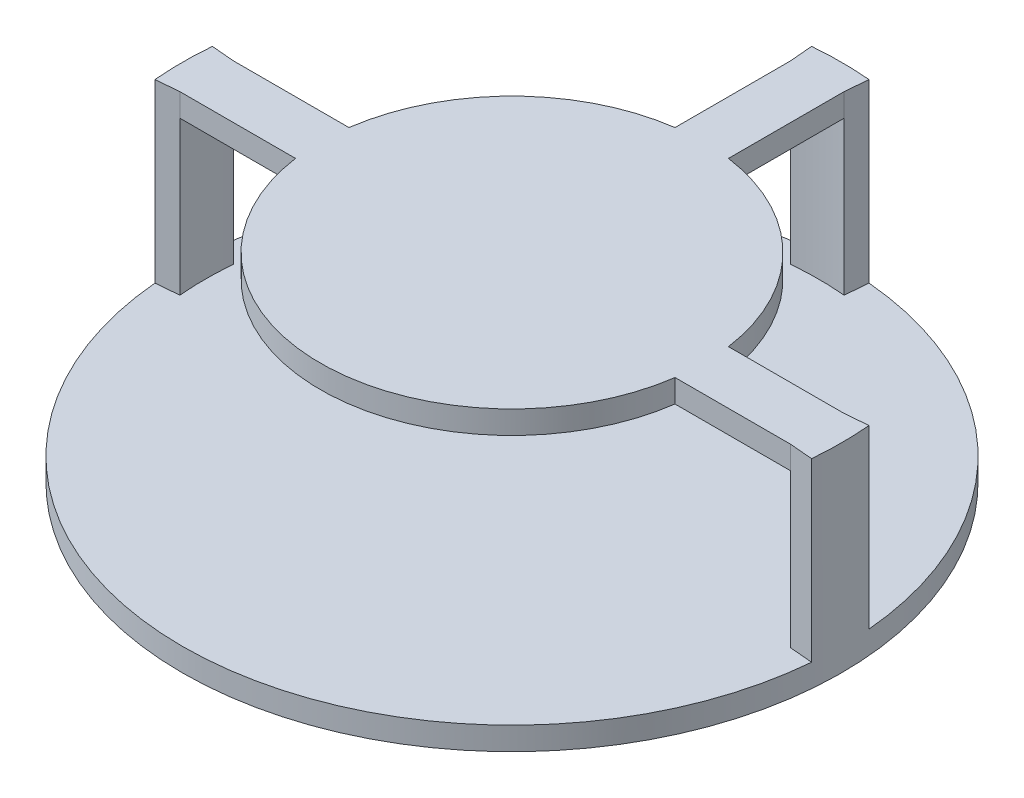
ISO-10303-21;
HEADER;
FILE_DESCRIPTION(('STEP AP214'),'2;1');
FILE_NAME('part.step','',(''),(''),'','','');
FILE_SCHEMA(('AUTOMOTIVE_DESIGN { 1 0 10303 214 1 1 1 1 }'));
ENDSEC;
DATA;
#1=APPLICATION_CONTEXT('core data for automotive mechanical design processes');
#2=APPLICATION_PROTOCOL_DEFINITION('international standard','automotive_design',2000,#1);
#3=PRODUCT_CONTEXT('',#1,'mechanical');
#4=PRODUCT('Part','Part','',(#3));
#5=PRODUCT_RELATED_PRODUCT_CATEGORY('part','',(#4));
#6=PRODUCT_DEFINITION_FORMATION('','',#4);
#7=PRODUCT_DEFINITION_CONTEXT('part definition',#1,'design');
#8=PRODUCT_DEFINITION('design','',#6,#7);
#9=PRODUCT_DEFINITION_SHAPE('','',#8);
#10=(LENGTH_UNIT() NAMED_UNIT(*) SI_UNIT(.MILLI.,.METRE.));
#11=(NAMED_UNIT(*) PLANE_ANGLE_UNIT() SI_UNIT($,.RADIAN.));
#12=(NAMED_UNIT(*) SI_UNIT($,.STERADIAN.) SOLID_ANGLE_UNIT());
#13=UNCERTAINTY_MEASURE_WITH_UNIT(LENGTH_MEASURE(1.E-05),#10,'distance_accuracy_value','');
#14=(GEOMETRIC_REPRESENTATION_CONTEXT(3) GLOBAL_UNCERTAINTY_ASSIGNED_CONTEXT((#13)) GLOBAL_UNIT_ASSIGNED_CONTEXT((#10,
#11,#12)) REPRESENTATION_CONTEXT('',''));
#15=CARTESIAN_POINT('',(0.,0.,0.));
#16=DIRECTION('',(0.,0.,1.));
#17=DIRECTION('',(1.,0.,0.));
#18=AXIS2_PLACEMENT_3D('',#15,#16,#17);
#19=CARTESIAN_POINT('',(0.,3.,0.));
#20=DIRECTION('',(0.,1.,0.));
#21=DIRECTION('',(0.,0.,1.));
#22=AXIS2_PLACEMENT_3D('',#19,#20,#21);
#23=PLANE('',#22);
#24=CARTESIAN_POINT('',(0.,3.,0.));
#25=DIRECTION('',(0.,1.,0.));
#26=DIRECTION('',(0.,0.,1.));
#27=AXIS2_PLACEMENT_3D('',#24,#25,#26);
#28=CIRCLE('',#27,43.);
#29=CARTESIAN_POINT('',(42.8363720179451,3.,-3.747696938149));
#30=VERTEX_POINT('',#29);
#31=CARTESIAN_POINT('',(3.74769693814913,3.,-42.8363720179451));
#32=VERTEX_POINT('',#31);
#33=EDGE_CURVE('E51',#30,#32,#28,.T.);
#34=ORIENTED_EDGE('',*,*,#33,.T.);
#35=DIRECTION('',(0.0871557427476543,0.,-0.996194698091746));
#36=VECTOR('',#35,1.);
#37=CARTESIAN_POINT('',(0.,3.,0.));
#38=LINE('',#37,#36);
#39=CARTESIAN_POINT('',(3.48622574690307,3.,-39.8477426263371));
#40=VERTEX_POINT('',#39);
#41=EDGE_CURVE('E59',#40,#32,#38,.T.);
#42=ORIENTED_EDGE('',*,*,#41,.F.);
#43=CARTESIAN_POINT('',(0.,3.,0.));
#44=DIRECTION('',(0.,1.,0.));
#45=DIRECTION('',(0.,0.,1.));
#46=AXIS2_PLACEMENT_3D('',#43,#44,#45);
#47=CIRCLE('',#46,39.9999545296388);
#48=CARTESIAN_POINT('',(-3.48622574690337,3.,-39.8477426263371));
#49=VERTEX_POINT('',#48);
#50=EDGE_CURVE('E64',#40,#49,#47,.T.);
#51=ORIENTED_EDGE('',*,*,#50,.T.);
#52=DIRECTION('',(-0.0871557427476619,0.,-0.996194698091745));
#53=VECTOR('',#52,1.);
#54=CARTESIAN_POINT('',(0.,3.,0.));
#55=LINE('',#54,#53);
#56=CARTESIAN_POINT('',(-3.74769693814946,3.,-42.836372017945));
#57=VERTEX_POINT('',#56);
#58=EDGE_CURVE('E348',#49,#57,#55,.T.);
#59=ORIENTED_EDGE('',*,*,#58,.T.);
#60=CARTESIAN_POINT('',(-42.8363720179451,3.,-3.747696938149));
#61=VERTEX_POINT('',#60);
#62=EDGE_CURVE('E52',#57,#61,#28,.T.);
#63=ORIENTED_EDGE('',*,*,#62,.T.);
#64=DIRECTION('',(-0.996194698091746,0.,-0.0871557427476513));
#65=VECTOR('',#64,1.);
#66=CARTESIAN_POINT('',(0.,3.,0.));
#67=LINE('',#66,#65);
#68=CARTESIAN_POINT('',(-39.8477426263371,3.,-3.48622574690295));
#69=VERTEX_POINT('',#68);
#70=EDGE_CURVE('E404',#69,#61,#67,.T.);
#71=ORIENTED_EDGE('',*,*,#70,.F.);
#72=CARTESIAN_POINT('',(0.,3.,0.));
#73=DIRECTION('',(0.,1.,0.));
#74=DIRECTION('',(0.,0.,1.));
#75=AXIS2_PLACEMENT_3D('',#72,#73,#74);
#76=CIRCLE('',#75,39.9999545296388);
#77=CARTESIAN_POINT('',(-39.8477426263371,3.,3.48622574690295));
#78=VERTEX_POINT('',#77);
#79=EDGE_CURVE('E395',#69,#78,#76,.T.);
#80=ORIENTED_EDGE('',*,*,#79,.T.);
#81=DIRECTION('',(-0.996194698091746,0.,0.0871557427476512));
#82=VECTOR('',#81,1.);
#83=CARTESIAN_POINT('',(0.,3.,0.));
#84=LINE('',#83,#82);
#85=CARTESIAN_POINT('',(-42.8363720179451,3.,3.747696938149));
#86=VERTEX_POINT('',#85);
#87=EDGE_CURVE('E401',#78,#86,#84,.T.);
#88=ORIENTED_EDGE('',*,*,#87,.T.);
#89=CARTESIAN_POINT('',(42.8363720179451,3.,3.747696938149));
#90=VERTEX_POINT('',#89);
#91=EDGE_CURVE('E11',#86,#90,#28,.T.);
#92=ORIENTED_EDGE('',*,*,#91,.T.);
#93=DIRECTION('',(0.996194698091746,0.,0.0871557427476512));
#94=VECTOR('',#93,1.);
#95=CARTESIAN_POINT('',(0.,3.,0.));
#96=LINE('',#95,#94);
#97=CARTESIAN_POINT('',(39.8477426263371,3.,3.48622574690295));
#98=VERTEX_POINT('',#97);
#99=EDGE_CURVE('E375',#98,#90,#96,.T.);
#100=ORIENTED_EDGE('',*,*,#99,.F.);
#101=CARTESIAN_POINT('',(0.,3.,0.));
#102=DIRECTION('',(0.,1.,0.));
#103=DIRECTION('',(0.,0.,1.));
#104=AXIS2_PLACEMENT_3D('',#101,#102,#103);
#105=CIRCLE('',#104,39.9999545296388);
#106=CARTESIAN_POINT('',(39.8477426263371,3.,-3.48622574690295));
#107=VERTEX_POINT('',#106);
#108=EDGE_CURVE('E368',#98,#107,#105,.T.);
#109=ORIENTED_EDGE('',*,*,#108,.T.);
#110=DIRECTION('',(0.996194698091746,0.,-0.0871557427476512));
#111=VECTOR('',#110,1.);
#112=CARTESIAN_POINT('',(0.,3.,0.));
#113=LINE('',#112,#111);
#114=EDGE_CURVE('E372',#107,#30,#113,.T.);
#115=ORIENTED_EDGE('',*,*,#114,.T.);
#116=EDGE_LOOP('',(#34,#42,#51,#59,#63,#71,#80,#88,#92,#100,#109,#115));
#117=FACE_BOUND('',#116,.T.);
#118=ADVANCED_FACE('F41',(#117),#23,.T.);
#119=CARTESIAN_POINT('',(0.,3.,0.));
#120=DIRECTION('',(0.,-1.,0.));
#121=DIRECTION('',(0.,0.,-1.));
#122=AXIS2_PLACEMENT_3D('',#119,#120,#121);
#123=CYLINDRICAL_SURFACE('',#122,43.);
#124=ORIENTED_EDGE('',*,*,#91,.F.);
#125=DIRECTION('',(0.,-1.,0.));
#126=VECTOR('',#125,1.);
#127=CARTESIAN_POINT('',(-42.8363720179451,23.,3.747696938149));
#128=LINE('',#127,#126);
#129=CARTESIAN_POINT('',(-42.8363720179451,26.,3.747696938149));
#130=VERTEX_POINT('',#129);
#131=EDGE_CURVE('E413',#130,#86,#128,.T.);
#132=ORIENTED_EDGE('',*,*,#131,.F.);
#133=CARTESIAN_POINT('',(0.,26.,0.));
#134=DIRECTION('',(0.,1.,0.));
#135=DIRECTION('',(0.,0.,1.));
#136=AXIS2_PLACEMENT_3D('',#133,#134,#135);
#137=CIRCLE('',#136,43.);
#138=CARTESIAN_POINT('',(-42.8363720179451,26.,-3.747696938149));
#139=VERTEX_POINT('',#138);
#140=EDGE_CURVE('E255',#139,#130,#137,.T.);
#141=ORIENTED_EDGE('',*,*,#140,.F.);
#142=DIRECTION('',(0.,-1.,0.));
#143=VECTOR('',#142,1.);
#144=CARTESIAN_POINT('',(-42.8363720179451,23.,-3.747696938149));
#145=LINE('',#144,#143);
#146=EDGE_CURVE('E417',#139,#61,#145,.T.);
#147=ORIENTED_EDGE('',*,*,#146,.T.);
#148=ORIENTED_EDGE('',*,*,#62,.F.);
#149=DIRECTION('',(0.,-1.,0.));
#150=VECTOR('',#149,1.);
#151=CARTESIAN_POINT('',(-3.74769693814946,23.,-42.836372017945));
#152=LINE('',#151,#150);
#153=CARTESIAN_POINT('',(-3.74769693814946,26.,-42.836372017945));
#154=VERTEX_POINT('',#153);
#155=EDGE_CURVE('E357',#154,#57,#152,.T.);
#156=ORIENTED_EDGE('',*,*,#155,.F.);
#157=CARTESIAN_POINT('',(0.,26.,0.));
#158=DIRECTION('',(0.,1.,0.));
#159=DIRECTION('',(0.,0.,1.));
#160=AXIS2_PLACEMENT_3D('',#157,#158,#159);
#161=CIRCLE('',#160,43.);
#162=CARTESIAN_POINT('',(3.74769693814913,26.,-42.8363720179451));
#163=VERTEX_POINT('',#162);
#164=EDGE_CURVE('E233',#163,#154,#161,.T.);
#165=ORIENTED_EDGE('',*,*,#164,.F.);
#166=DIRECTION('',(0.,-1.,0.));
#167=VECTOR('',#166,1.);
#168=CARTESIAN_POINT('',(3.74769693814913,23.,-42.8363720179451));
#169=LINE('',#168,#167);
#170=EDGE_CURVE('E361',#163,#32,#169,.T.);
#171=ORIENTED_EDGE('',*,*,#170,.T.);
#172=ORIENTED_EDGE('',*,*,#33,.F.);
#173=DIRECTION('',(0.,-1.,0.));
#174=VECTOR('',#173,1.);
#175=CARTESIAN_POINT('',(42.8363720179451,23.,-3.747696938149));
#176=LINE('',#175,#174);
#177=CARTESIAN_POINT('',(42.8363720179451,26.,-3.747696938149));
#178=VERTEX_POINT('',#177);
#179=EDGE_CURVE('E384',#178,#30,#176,.T.);
#180=ORIENTED_EDGE('',*,*,#179,.F.);
#181=CARTESIAN_POINT('',(0.,26.,0.));
#182=DIRECTION('',(0.,1.,0.));
#183=DIRECTION('',(0.,0.,1.));
#184=AXIS2_PLACEMENT_3D('',#181,#182,#183);
#185=CIRCLE('',#184,43.);
#186=CARTESIAN_POINT('',(42.8363720179451,26.,3.747696938149));
#187=VERTEX_POINT('',#186);
#188=EDGE_CURVE('E214',#187,#178,#185,.T.);
#189=ORIENTED_EDGE('',*,*,#188,.F.);
#190=DIRECTION('',(0.,-1.,0.));
#191=VECTOR('',#190,1.);
#192=CARTESIAN_POINT('',(42.8363720179451,23.,3.747696938149));
#193=LINE('',#192,#191);
#194=EDGE_CURVE('E387',#187,#90,#193,.T.);
#195=ORIENTED_EDGE('',*,*,#194,.T.);
#196=EDGE_LOOP('',(#124,#132,#141,#147,#148,#156,#165,#171,#172,#180,#189,#195));
#197=FACE_BOUND('',#196,.T.);
#198=CARTESIAN_POINT('',(0.,0.,0.));
#199=DIRECTION('',(0.,1.,0.));
#200=DIRECTION('',(0.,0.,1.));
#201=AXIS2_PLACEMENT_3D('',#198,#199,#200);
#202=CIRCLE('',#201,43.);
#203=CARTESIAN_POINT('',(0.,0.,43.));
#204=VERTEX_POINT('',#203);
#205=EDGE_CURVE('E45',#204,#204,#202,.T.);
#206=ORIENTED_EDGE('',*,*,#205,.T.);
#207=EDGE_LOOP('',(#206));
#208=FACE_BOUND('',#207,.T.);
#209=ADVANCED_FACE('F43',(#197,#208),#123,.T.);
#210=CARTESIAN_POINT('',(0.,0.,0.));
#211=DIRECTION('',(0.,1.,0.));
#212=DIRECTION('',(0.,0.,1.));
#213=AXIS2_PLACEMENT_3D('',#210,#211,#212);
#214=PLANE('',#213);
#215=ORIENTED_EDGE('',*,*,#205,.F.);
#216=EDGE_LOOP('',(#215));
#217=FACE_BOUND('',#216,.T.);
#218=ADVANCED_FACE('F507',(#217),#214,.F.);
#219=CARTESIAN_POINT('',(0.,23.,0.));
#220=DIRECTION('',(0.,-1.,0.));
#221=DIRECTION('',(0.,0.,-1.));
#222=AXIS2_PLACEMENT_3D('',#219,#220,#221);
#223=CYLINDRICAL_SURFACE('',#222,39.9999545296388);
#224=ORIENTED_EDGE('',*,*,#79,.F.);
#225=DIRECTION('',(0.,-1.,0.));
#226=VECTOR('',#225,1.);
#227=CARTESIAN_POINT('',(-39.8477426263371,23.,-3.48622574690295));
#228=LINE('',#227,#226);
#229=CARTESIAN_POINT('',(-39.8477426263371,23.,-3.48622574690295));
#230=VERTEX_POINT('',#229);
#231=EDGE_CURVE('E421',#230,#69,#228,.T.);
#232=ORIENTED_EDGE('',*,*,#231,.F.);
#233=CARTESIAN_POINT('',(0.,23.,0.));
#234=DIRECTION('',(0.,1.,0.));
#235=DIRECTION('',(0.,0.,1.));
#236=AXIS2_PLACEMENT_3D('',#233,#234,#235);
#237=CIRCLE('',#236,39.9999545296388);
#238=CARTESIAN_POINT('',(-39.8477426263371,23.,3.48622574690295));
#239=VERTEX_POINT('',#238);
#240=EDGE_CURVE('E396',#230,#239,#237,.T.);
#241=ORIENTED_EDGE('',*,*,#240,.T.);
#242=DIRECTION('',(0.,-1.,0.));
#243=VECTOR('',#242,1.);
#244=CARTESIAN_POINT('',(-39.8477426263371,23.,3.48622574690295));
#245=LINE('',#244,#243);
#246=EDGE_CURVE('E400',#239,#78,#245,.T.);
#247=ORIENTED_EDGE('',*,*,#246,.T.);
#248=EDGE_LOOP('',(#224,#232,#241,#247));
#249=FACE_BOUND('',#248,.T.);
#250=ADVANCED_FACE('F487',(#249),#223,.F.);
#251=CARTESIAN_POINT('',(0.,23.,0.));
#252=DIRECTION('',(-0.0871557427476512,0.,0.996194698091746));
#253=DIRECTION('',(0.996194698091746,0.,0.0871557427476513));
#254=AXIS2_PLACEMENT_3D('',#251,#252,#253);
#255=PLANE('',#254);
#256=ORIENTED_EDGE('',*,*,#70,.T.);
#257=ORIENTED_EDGE('',*,*,#146,.F.);
#258=DIRECTION('',(-0.996194698091746,0.,-0.0871557427476512));
#259=VECTOR('',#258,1.);
#260=CARTESIAN_POINT('',(0.,26.,0.));
#261=LINE('',#260,#259);
#262=CARTESIAN_POINT('',(-39.8477426263371,26.,-3.48622574690295));
#263=VERTEX_POINT('',#262);
#264=EDGE_CURVE('E251',#263,#139,#261,.T.);
#265=ORIENTED_EDGE('',*,*,#264,.F.);
#266=DIRECTION('',(0.,-1.,0.));
#267=VECTOR('',#266,1.);
#268=CARTESIAN_POINT('',(-39.8477426263371,26.,-3.48622574690295));
#269=LINE('',#268,#267);
#270=EDGE_CURVE('E320',#263,#230,#269,.T.);
#271=ORIENTED_EDGE('',*,*,#270,.T.);
#272=ORIENTED_EDGE('',*,*,#231,.T.);
#273=EDGE_LOOP('',(#256,#257,#265,#271,#272));
#274=FACE_BOUND('',#273,.T.);
#275=ADVANCED_FACE('F461',(#274),#255,.F.);
#276=CARTESIAN_POINT('',(0.,23.,0.));
#277=DIRECTION('',(0.0871557427476512,0.,0.996194698091746));
#278=DIRECTION('',(0.996194698091746,0.,-0.0871557427476512));
#279=AXIS2_PLACEMENT_3D('',#276,#277,#278);
#280=PLANE('',#279);
#281=ORIENTED_EDGE('',*,*,#87,.F.);
#282=ORIENTED_EDGE('',*,*,#246,.F.);
#283=DIRECTION('',(0.,-1.,0.));
#284=VECTOR('',#283,1.);
#285=CARTESIAN_POINT('',(-39.8477426263371,26.,3.48622574690295));
#286=LINE('',#285,#284);
#287=CARTESIAN_POINT('',(-39.8477426263371,26.,3.48622574690295));
#288=VERTEX_POINT('',#287);
#289=EDGE_CURVE('E317',#288,#239,#286,.T.);
#290=ORIENTED_EDGE('',*,*,#289,.F.);
#291=DIRECTION('',(-0.996194698091746,0.,0.0871557427476512));
#292=VECTOR('',#291,1.);
#293=CARTESIAN_POINT('',(0.,26.,0.));
#294=LINE('',#293,#292);
#295=EDGE_CURVE('E259',#288,#130,#294,.T.);
#296=ORIENTED_EDGE('',*,*,#295,.T.);
#297=ORIENTED_EDGE('',*,*,#131,.T.);
#298=EDGE_LOOP('',(#281,#282,#290,#296,#297));
#299=FACE_BOUND('',#298,.T.);
#300=ADVANCED_FACE('F466',(#299),#280,.T.);
#301=CARTESIAN_POINT('',(0.,23.,0.));
#302=DIRECTION('',(0.,-1.,0.));
#303=DIRECTION('',(0.,0.,-1.));
#304=AXIS2_PLACEMENT_3D('',#301,#302,#303);
#305=CYLINDRICAL_SURFACE('',#304,39.9999545296388);
#306=ORIENTED_EDGE('',*,*,#108,.F.);
#307=DIRECTION('',(0.,-1.,0.));
#308=VECTOR('',#307,1.);
#309=CARTESIAN_POINT('',(39.8477426263371,23.,3.48622574690295));
#310=LINE('',#309,#308);
#311=CARTESIAN_POINT('',(39.8477426263371,23.,3.48622574690295));
#312=VERTEX_POINT('',#311);
#313=EDGE_CURVE('E391',#312,#98,#310,.T.);
#314=ORIENTED_EDGE('',*,*,#313,.F.);
#315=CARTESIAN_POINT('',(0.,23.,0.));
#316=DIRECTION('',(0.,1.,0.));
#317=DIRECTION('',(0.,0.,1.));
#318=AXIS2_PLACEMENT_3D('',#315,#316,#317);
#319=CIRCLE('',#318,39.9999545296388);
#320=CARTESIAN_POINT('',(39.8477426263371,23.,-3.48622574690295));
#321=VERTEX_POINT('',#320);
#322=EDGE_CURVE('E369',#312,#321,#319,.T.);
#323=ORIENTED_EDGE('',*,*,#322,.T.);
#324=DIRECTION('',(0.,-1.,0.));
#325=VECTOR('',#324,1.);
#326=CARTESIAN_POINT('',(39.8477426263371,23.,-3.48622574690295));
#327=LINE('',#326,#325);
#328=EDGE_CURVE('E194',#321,#107,#327,.T.);
#329=ORIENTED_EDGE('',*,*,#328,.T.);
#330=EDGE_LOOP('',(#306,#314,#323,#329));
#331=FACE_BOUND('',#330,.T.);
#332=ADVANCED_FACE('F493',(#331),#305,.F.);
#333=CARTESIAN_POINT('',(0.,23.,0.));
#334=DIRECTION('',(0.0871557427476512,0.,-0.996194698091746));
#335=DIRECTION('',(-0.996194698091746,0.,-0.0871557427476512));
#336=AXIS2_PLACEMENT_3D('',#333,#334,#335);
#337=PLANE('',#336);
#338=ORIENTED_EDGE('',*,*,#99,.T.);
#339=ORIENTED_EDGE('',*,*,#194,.F.);
#340=DIRECTION('',(0.996194698091746,0.,0.0871557427476512));
#341=VECTOR('',#340,1.);
#342=CARTESIAN_POINT('',(0.,26.,0.));
#343=LINE('',#342,#341);
#344=CARTESIAN_POINT('',(39.8477426263371,26.,3.48622574690295));
#345=VERTEX_POINT('',#344);
#346=EDGE_CURVE('E273',#345,#187,#343,.T.);
#347=ORIENTED_EDGE('',*,*,#346,.F.);
#348=DIRECTION('',(0.,-1.,0.));
#349=VECTOR('',#348,1.);
#350=CARTESIAN_POINT('',(39.8477426263371,26.,3.48622574690295));
#351=LINE('',#350,#349);
#352=EDGE_CURVE('E278',#345,#312,#351,.T.);
#353=ORIENTED_EDGE('',*,*,#352,.T.);
#354=ORIENTED_EDGE('',*,*,#313,.T.);
#355=EDGE_LOOP('',(#338,#339,#347,#353,#354));
#356=FACE_BOUND('',#355,.T.);
#357=ADVANCED_FACE('F484',(#356),#337,.F.);
#358=CARTESIAN_POINT('',(0.,23.,0.));
#359=DIRECTION('',(-0.0871557427476512,0.,-0.996194698091746));
#360=DIRECTION('',(-0.996194698091746,0.,0.0871557427476512));
#361=AXIS2_PLACEMENT_3D('',#358,#359,#360);
#362=PLANE('',#361);
#363=ORIENTED_EDGE('',*,*,#114,.F.);
#364=ORIENTED_EDGE('',*,*,#328,.F.);
#365=DIRECTION('',(0.,-1.,0.));
#366=VECTOR('',#365,1.);
#367=CARTESIAN_POINT('',(39.8477426263371,26.,-3.48622574690295));
#368=LINE('',#367,#366);
#369=CARTESIAN_POINT('',(39.8477426263371,26.,-3.48622574690295));
#370=VERTEX_POINT('',#369);
#371=EDGE_CURVE('E186',#370,#321,#368,.T.);
#372=ORIENTED_EDGE('',*,*,#371,.F.);
#373=DIRECTION('',(0.996194698091746,0.,-0.0871557427476512));
#374=VECTOR('',#373,1.);
#375=CARTESIAN_POINT('',(0.,26.,0.));
#376=LINE('',#375,#374);
#377=EDGE_CURVE('E192',#370,#178,#376,.T.);
#378=ORIENTED_EDGE('',*,*,#377,.T.);
#379=ORIENTED_EDGE('',*,*,#179,.T.);
#380=EDGE_LOOP('',(#363,#364,#372,#378,#379));
#381=FACE_BOUND('',#380,.T.);
#382=ADVANCED_FACE('F189',(#381),#362,.T.);
#383=CARTESIAN_POINT('',(0.,23.,0.));
#384=DIRECTION('',(0.,-1.,0.));
#385=DIRECTION('',(0.,0.,-1.));
#386=AXIS2_PLACEMENT_3D('',#383,#384,#385);
#387=CYLINDRICAL_SURFACE('',#386,39.9999545296388);
#388=ORIENTED_EDGE('',*,*,#50,.F.);
#389=DIRECTION('',(0.,-1.,0.));
#390=VECTOR('',#389,1.);
#391=CARTESIAN_POINT('',(3.48622574690307,23.,-39.8477426263371));
#392=LINE('',#391,#390);
#393=CARTESIAN_POINT('',(3.48622574690307,23.,-39.8477426263371));
#394=VERTEX_POINT('',#393);
#395=EDGE_CURVE('E365',#394,#40,#392,.T.);
#396=ORIENTED_EDGE('',*,*,#395,.F.);
#397=CARTESIAN_POINT('',(0.,23.,0.));
#398=DIRECTION('',(0.,1.,0.));
#399=DIRECTION('',(0.,0.,1.));
#400=AXIS2_PLACEMENT_3D('',#397,#398,#399);
#401=CIRCLE('',#400,39.9999545296388);
#402=CARTESIAN_POINT('',(-3.48622574690337,23.,-39.8477426263371));
#403=VERTEX_POINT('',#402);
#404=EDGE_CURVE('E343',#394,#403,#401,.T.);
#405=ORIENTED_EDGE('',*,*,#404,.T.);
#406=DIRECTION('',(0.,-1.,0.));
#407=VECTOR('',#406,1.);
#408=CARTESIAN_POINT('',(-3.48622574690337,23.,-39.8477426263371));
#409=LINE('',#408,#407);
#410=EDGE_CURVE('E347',#403,#49,#409,.T.);
#411=ORIENTED_EDGE('',*,*,#410,.T.);
#412=EDGE_LOOP('',(#388,#396,#405,#411));
#413=FACE_BOUND('',#412,.T.);
#414=ADVANCED_FACE('F545',(#413),#387,.F.);
#415=CARTESIAN_POINT('',(0.,23.,0.));
#416=DIRECTION('',(-0.996194698091746,0.,-0.0871557427476543));
#417=DIRECTION('',(-0.0871557427476543,0.,0.996194698091746));
#418=AXIS2_PLACEMENT_3D('',#415,#416,#417);
#419=PLANE('',#418);
#420=ORIENTED_EDGE('',*,*,#41,.T.);
#421=ORIENTED_EDGE('',*,*,#170,.F.);
#422=DIRECTION('',(0.0871557427476543,0.,-0.996194698091746));
#423=VECTOR('',#422,1.);
#424=CARTESIAN_POINT('',(0.,26.,0.));
#425=LINE('',#424,#423);
#426=CARTESIAN_POINT('',(3.48622574690307,26.,-39.8477426263371));
#427=VERTEX_POINT('',#426);
#428=EDGE_CURVE('E229',#427,#163,#425,.T.);
#429=ORIENTED_EDGE('',*,*,#428,.F.);
#430=DIRECTION('',(0.,-1.,0.));
#431=VECTOR('',#430,1.);
#432=CARTESIAN_POINT('',(3.48622574690307,26.,-39.8477426263371));
#433=LINE('',#432,#431);
#434=EDGE_CURVE('E334',#427,#394,#433,.T.);
#435=ORIENTED_EDGE('',*,*,#434,.T.);
#436=ORIENTED_EDGE('',*,*,#395,.T.);
#437=EDGE_LOOP('',(#420,#421,#429,#435,#436));
#438=FACE_BOUND('',#437,.T.);
#439=ADVANCED_FACE('F435',(#438),#419,.F.);
#440=CARTESIAN_POINT('',(0.,23.,0.));
#441=DIRECTION('',(-0.996194698091745,0.,0.0871557427476619));
#442=DIRECTION('',(0.0871557427476619,0.,0.996194698091745));
#443=AXIS2_PLACEMENT_3D('',#440,#441,#442);
#444=PLANE('',#443);
#445=ORIENTED_EDGE('',*,*,#58,.F.);
#446=ORIENTED_EDGE('',*,*,#410,.F.);
#447=DIRECTION('',(0.,-1.,0.));
#448=VECTOR('',#447,1.);
#449=CARTESIAN_POINT('',(-3.48622574690337,26.,-39.8477426263371));
#450=LINE('',#449,#448);
#451=CARTESIAN_POINT('',(-3.48622574690337,26.,-39.8477426263371));
#452=VERTEX_POINT('',#451);
#453=EDGE_CURVE('E331',#452,#403,#450,.T.);
#454=ORIENTED_EDGE('',*,*,#453,.F.);
#455=DIRECTION('',(-0.0871557427476619,0.,-0.996194698091745));
#456=VECTOR('',#455,1.);
#457=CARTESIAN_POINT('',(0.,26.,0.));
#458=LINE('',#457,#456);
#459=EDGE_CURVE('E237',#452,#154,#458,.T.);
#460=ORIENTED_EDGE('',*,*,#459,.T.);
#461=ORIENTED_EDGE('',*,*,#155,.T.);
#462=EDGE_LOOP('',(#445,#446,#454,#460,#461));
#463=FACE_BOUND('',#462,.T.);
#464=ADVANCED_FACE('F444',(#463),#444,.T.);
#465=CARTESIAN_POINT('',(0.,26.,-3.48622574690295));
#466=DIRECTION('',(0.,0.,1.));
#467=DIRECTION('',(1.,0.,0.));
#468=AXIS2_PLACEMENT_3D('',#465,#466,#467);
#469=PLANE('',#468);
#470=DIRECTION('',(-1.,0.,0.));
#471=VECTOR('',#470,1.);
#472=CARTESIAN_POINT('',(0.,23.,-3.48622574690295));
#473=LINE('',#472,#471);
#474=CARTESIAN_POINT('',(24.7557312564511,23.,-3.48622574690295));
#475=VERTEX_POINT('',#474);
#476=EDGE_CURVE('E279',#321,#475,#473,.T.);
#477=ORIENTED_EDGE('',*,*,#476,.T.);
#478=DIRECTION('',(0.,-1.,0.));
#479=VECTOR('',#478,1.);
#480=CARTESIAN_POINT('',(24.7557312564511,26.,-3.48622574690295));
#481=LINE('',#480,#479);
#482=CARTESIAN_POINT('',(24.7557312564511,26.,-3.48622574690295));
#483=VERTEX_POINT('',#482);
#484=EDGE_CURVE('E199',#483,#475,#481,.T.);
#485=ORIENTED_EDGE('',*,*,#484,.F.);
#486=DIRECTION('',(-1.,0.,0.));
#487=VECTOR('',#486,1.);
#488=CARTESIAN_POINT('',(0.,26.,-3.48622574690295));
#489=LINE('',#488,#487);
#490=EDGE_CURVE('E202',#370,#483,#489,.T.);
#491=ORIENTED_EDGE('',*,*,#490,.F.);
#492=ORIENTED_EDGE('',*,*,#371,.T.);
#493=EDGE_LOOP('',(#477,#485,#491,#492));
#494=FACE_BOUND('',#493,.T.);
#495=ADVANCED_FACE('F203',(#494),#469,.F.);
#496=CARTESIAN_POINT('',(0.,26.,0.));
#497=DIRECTION('',(0.,-1.,0.));
#498=DIRECTION('',(0.,0.,-1.));
#499=AXIS2_PLACEMENT_3D('',#496,#497,#498);
#500=CYLINDRICAL_SURFACE('',#499,25.);
#501=CARTESIAN_POINT('',(0.,23.,0.));
#502=DIRECTION('',(0.,1.,0.));
#503=DIRECTION('',(0.,0.,1.));
#504=AXIS2_PLACEMENT_3D('',#501,#502,#503);
#505=CIRCLE('',#504,25.);
#506=CARTESIAN_POINT('',(3.48622574690307,23.,-24.7557312564511));
#507=VERTEX_POINT('',#506);
#508=EDGE_CURVE('E282',#475,#507,#505,.T.);
#509=ORIENTED_EDGE('',*,*,#508,.T.);
#510=DIRECTION('',(0.,-1.,0.));
#511=VECTOR('',#510,1.);
#512=CARTESIAN_POINT('',(3.48622574690307,26.,-24.7557312564511));
#513=LINE('',#512,#511);
#514=CARTESIAN_POINT('',(3.48622574690307,26.,-24.7557312564511));
#515=VERTEX_POINT('',#514);
#516=EDGE_CURVE('E338',#515,#507,#513,.T.);
#517=ORIENTED_EDGE('',*,*,#516,.F.);
#518=CARTESIAN_POINT('',(0.,26.,0.));
#519=DIRECTION('',(0.,1.,0.));
#520=DIRECTION('',(0.,0.,1.));
#521=AXIS2_PLACEMENT_3D('',#518,#519,#520);
#522=CIRCLE('',#521,25.);
#523=EDGE_CURVE('E208',#483,#515,#522,.T.);
#524=ORIENTED_EDGE('',*,*,#523,.F.);
#525=ORIENTED_EDGE('',*,*,#484,.T.);
#526=EDGE_LOOP('',(#509,#517,#524,#525));
#527=FACE_BOUND('',#526,.T.);
#528=ADVANCED_FACE('F582',(#527),#500,.T.);
#529=CARTESIAN_POINT('',(3.48622574690307,26.,0.));
#530=DIRECTION('',(1.,0.,0.));
#531=DIRECTION('',(0.,0.,-1.));
#532=AXIS2_PLACEMENT_3D('',#529,#530,#531);
#533=PLANE('',#532);
#534=DIRECTION('',(0.,0.,1.));
#535=VECTOR('',#534,1.);
#536=CARTESIAN_POINT('',(3.48622574690307,23.,0.));
#537=LINE('',#536,#535);
#538=EDGE_CURVE('E286',#394,#507,#537,.T.);
#539=ORIENTED_EDGE('',*,*,#538,.F.);
#540=ORIENTED_EDGE('',*,*,#434,.F.);
#541=DIRECTION('',(0.,0.,1.));
#542=VECTOR('',#541,1.);
#543=CARTESIAN_POINT('',(3.48622574690307,26.,0.));
#544=LINE('',#543,#542);
#545=EDGE_CURVE('E225',#427,#515,#544,.T.);
#546=ORIENTED_EDGE('',*,*,#545,.T.);
#547=ORIENTED_EDGE('',*,*,#516,.T.);
#548=EDGE_LOOP('',(#539,#540,#546,#547));
#549=FACE_BOUND('',#548,.T.);
#550=ADVANCED_FACE('F591',(#549),#533,.T.);
#551=CARTESIAN_POINT('',(-3.48622574690337,26.,0.));
#552=DIRECTION('',(1.,0.,0.));
#553=DIRECTION('',(0.,0.,-1.));
#554=AXIS2_PLACEMENT_3D('',#551,#552,#553);
#555=PLANE('',#554);
#556=DIRECTION('',(0.,0.,1.));
#557=VECTOR('',#556,1.);
#558=CARTESIAN_POINT('',(-3.48622574690337,23.,0.));
#559=LINE('',#558,#557);
#560=CARTESIAN_POINT('',(-3.48622574690337,23.,-24.7557312564511));
#561=VERTEX_POINT('',#560);
#562=EDGE_CURVE('E290',#403,#561,#559,.T.);
#563=ORIENTED_EDGE('',*,*,#562,.T.);
#564=DIRECTION('',(0.,-1.,0.));
#565=VECTOR('',#564,1.);
#566=CARTESIAN_POINT('',(-3.48622574690337,26.,-24.7557312564511));
#567=LINE('',#566,#565);
#568=CARTESIAN_POINT('',(-3.48622574690337,26.,-24.7557312564511));
#569=VERTEX_POINT('',#568);
#570=EDGE_CURVE('E327',#569,#561,#567,.T.);
#571=ORIENTED_EDGE('',*,*,#570,.F.);
#572=DIRECTION('',(0.,0.,1.));
#573=VECTOR('',#572,1.);
#574=CARTESIAN_POINT('',(-3.48622574690337,26.,0.));
#575=LINE('',#574,#573);
#576=EDGE_CURVE('E241',#452,#569,#575,.T.);
#577=ORIENTED_EDGE('',*,*,#576,.F.);
#578=ORIENTED_EDGE('',*,*,#453,.T.);
#579=EDGE_LOOP('',(#563,#571,#577,#578));
#580=FACE_BOUND('',#579,.T.);
#581=ADVANCED_FACE('F450',(#580),#555,.F.);
#582=CARTESIAN_POINT('',(0.,26.,0.));
#583=DIRECTION('',(0.,-1.,0.));
#584=DIRECTION('',(0.,0.,-1.));
#585=AXIS2_PLACEMENT_3D('',#582,#583,#584);
#586=CYLINDRICAL_SURFACE('',#585,25.);
#587=CARTESIAN_POINT('',(0.,23.,0.));
#588=DIRECTION('',(0.,1.,0.));
#589=DIRECTION('',(0.,0.,1.));
#590=AXIS2_PLACEMENT_3D('',#587,#588,#589);
#591=CIRCLE('',#590,25.);
#592=CARTESIAN_POINT('',(-24.7557312564511,23.,-3.48622574690295));
#593=VERTEX_POINT('',#592);
#594=EDGE_CURVE('E293',#561,#593,#591,.T.);
#595=ORIENTED_EDGE('',*,*,#594,.T.);
#596=DIRECTION('',(0.,-1.,0.));
#597=VECTOR('',#596,1.);
#598=CARTESIAN_POINT('',(-24.7557312564511,26.,-3.48622574690295));
#599=LINE('',#598,#597);
#600=CARTESIAN_POINT('',(-24.7557312564511,26.,-3.48622574690295));
#601=VERTEX_POINT('',#600);
#602=EDGE_CURVE('E324',#601,#593,#599,.T.);
#603=ORIENTED_EDGE('',*,*,#602,.F.);
#604=CARTESIAN_POINT('',(0.,26.,0.));
#605=DIRECTION('',(0.,1.,0.));
#606=DIRECTION('',(0.,0.,1.));
#607=AXIS2_PLACEMENT_3D('',#604,#605,#606);
#608=CIRCLE('',#607,25.);
#609=EDGE_CURVE('E244',#569,#601,#608,.T.);
#610=ORIENTED_EDGE('',*,*,#609,.F.);
#611=ORIENTED_EDGE('',*,*,#570,.T.);
#612=EDGE_LOOP('',(#595,#603,#610,#611));
#613=FACE_BOUND('',#612,.T.);
#614=ADVANCED_FACE('F455',(#613),#586,.T.);
#615=CARTESIAN_POINT('',(0.,26.,-3.48622574690295));
#616=DIRECTION('',(0.,0.,-1.));
#617=DIRECTION('',(-1.,0.,0.));
#618=AXIS2_PLACEMENT_3D('',#615,#616,#617);
#619=PLANE('',#618);
#620=DIRECTION('',(1.,0.,0.));
#621=VECTOR('',#620,1.);
#622=CARTESIAN_POINT('',(0.,23.,-3.48622574690295));
#623=LINE('',#622,#621);
#624=EDGE_CURVE('E297',#230,#593,#623,.T.);
#625=ORIENTED_EDGE('',*,*,#624,.F.);
#626=ORIENTED_EDGE('',*,*,#270,.F.);
#627=DIRECTION('',(1.,0.,0.));
#628=VECTOR('',#627,1.);
#629=CARTESIAN_POINT('',(0.,26.,-3.48622574690295));
#630=LINE('',#629,#628);
#631=EDGE_CURVE('E247',#263,#601,#630,.T.);
#632=ORIENTED_EDGE('',*,*,#631,.T.);
#633=ORIENTED_EDGE('',*,*,#602,.T.);
#634=EDGE_LOOP('',(#625,#626,#632,#633));
#635=FACE_BOUND('',#634,.T.);
#636=ADVANCED_FACE('F459',(#635),#619,.T.);
#637=CARTESIAN_POINT('',(0.,26.,3.48622574690295));
#638=DIRECTION('',(0.,0.,-1.));
#639=DIRECTION('',(-1.,0.,0.));
#640=AXIS2_PLACEMENT_3D('',#637,#638,#639);
#641=PLANE('',#640);
#642=DIRECTION('',(1.,0.,0.));
#643=VECTOR('',#642,1.);
#644=CARTESIAN_POINT('',(0.,23.,3.48622574690295));
#645=LINE('',#644,#643);
#646=CARTESIAN_POINT('',(-24.7557312564511,23.,3.48622574690295));
#647=VERTEX_POINT('',#646);
#648=EDGE_CURVE('E301',#239,#647,#645,.T.);
#649=ORIENTED_EDGE('',*,*,#648,.T.);
#650=DIRECTION('',(0.,-1.,0.));
#651=VECTOR('',#650,1.);
#652=CARTESIAN_POINT('',(-24.7557312564511,26.,3.48622574690295));
#653=LINE('',#652,#651);
#654=CARTESIAN_POINT('',(-24.7557312564511,26.,3.48622574690295));
#655=VERTEX_POINT('',#654);
#656=EDGE_CURVE('E313',#655,#647,#653,.T.);
#657=ORIENTED_EDGE('',*,*,#656,.F.);
#658=DIRECTION('',(1.,0.,0.));
#659=VECTOR('',#658,1.);
#660=CARTESIAN_POINT('',(0.,26.,3.48622574690295));
#661=LINE('',#660,#659);
#662=EDGE_CURVE('E263',#288,#655,#661,.T.);
#663=ORIENTED_EDGE('',*,*,#662,.F.);
#664=ORIENTED_EDGE('',*,*,#289,.T.);
#665=EDGE_LOOP('',(#649,#657,#663,#664));
#666=FACE_BOUND('',#665,.T.);
#667=ADVANCED_FACE('F474',(#666),#641,.F.);
#668=CARTESIAN_POINT('',(0.,26.,0.));
#669=DIRECTION('',(0.,-1.,0.));
#670=DIRECTION('',(0.,0.,-1.));
#671=AXIS2_PLACEMENT_3D('',#668,#669,#670);
#672=CYLINDRICAL_SURFACE('',#671,25.);
#673=CARTESIAN_POINT('',(0.,23.,0.));
#674=DIRECTION('',(0.,1.,0.));
#675=DIRECTION('',(0.,0.,1.));
#676=AXIS2_PLACEMENT_3D('',#673,#674,#675);
#677=CIRCLE('',#676,25.);
#678=CARTESIAN_POINT('',(24.7557312564511,23.,3.48622574690295));
#679=VERTEX_POINT('',#678);
#680=EDGE_CURVE('E220',#647,#679,#677,.T.);
#681=ORIENTED_EDGE('',*,*,#680,.T.);
#682=DIRECTION('',(0.,-1.,0.));
#683=VECTOR('',#682,1.);
#684=CARTESIAN_POINT('',(24.7557312564511,26.,3.48622574690295));
#685=LINE('',#684,#683);
#686=CARTESIAN_POINT('',(24.7557312564511,26.,3.48622574690295));
#687=VERTEX_POINT('',#686);
#688=EDGE_CURVE('E310',#687,#679,#685,.T.);
#689=ORIENTED_EDGE('',*,*,#688,.F.);
#690=CARTESIAN_POINT('',(0.,26.,0.));
#691=DIRECTION('',(0.,1.,0.));
#692=DIRECTION('',(0.,0.,1.));
#693=AXIS2_PLACEMENT_3D('',#690,#691,#692);
#694=CIRCLE('',#693,25.);
#695=EDGE_CURVE('E266',#655,#687,#694,.T.);
#696=ORIENTED_EDGE('',*,*,#695,.F.);
#697=ORIENTED_EDGE('',*,*,#656,.T.);
#698=EDGE_LOOP('',(#681,#689,#696,#697));
#699=FACE_BOUND('',#698,.T.);
#700=ADVANCED_FACE('F478',(#699),#672,.T.);
#701=CARTESIAN_POINT('',(0.,26.,3.48622574690295));
#702=DIRECTION('',(0.,0.,1.));
#703=DIRECTION('',(1.,0.,0.));
#704=AXIS2_PLACEMENT_3D('',#701,#702,#703);
#705=PLANE('',#704);
#706=DIRECTION('',(-1.,0.,0.));
#707=VECTOR('',#706,1.);
#708=CARTESIAN_POINT('',(0.,23.,3.48622574690295));
#709=LINE('',#708,#707);
#710=EDGE_CURVE('E216',#312,#679,#709,.T.);
#711=ORIENTED_EDGE('',*,*,#710,.F.);
#712=ORIENTED_EDGE('',*,*,#352,.F.);
#713=DIRECTION('',(-1.,0.,0.));
#714=VECTOR('',#713,1.);
#715=CARTESIAN_POINT('',(0.,26.,3.48622574690295));
#716=LINE('',#715,#714);
#717=EDGE_CURVE('E269',#345,#687,#716,.T.);
#718=ORIENTED_EDGE('',*,*,#717,.T.);
#719=ORIENTED_EDGE('',*,*,#688,.T.);
#720=EDGE_LOOP('',(#711,#712,#718,#719));
#721=FACE_BOUND('',#720,.T.);
#722=ADVANCED_FACE('F481',(#721),#705,.T.);
#723=CARTESIAN_POINT('',(0.,26.,0.));
#724=DIRECTION('',(0.,1.,0.));
#725=DIRECTION('',(0.,0.,1.));
#726=AXIS2_PLACEMENT_3D('',#723,#724,#725);
#727=PLANE('',#726);
#728=ORIENTED_EDGE('',*,*,#377,.F.);
#729=ORIENTED_EDGE('',*,*,#490,.T.);
#730=ORIENTED_EDGE('',*,*,#523,.T.);
#731=ORIENTED_EDGE('',*,*,#545,.F.);
#732=ORIENTED_EDGE('',*,*,#428,.T.);
#733=ORIENTED_EDGE('',*,*,#164,.T.);
#734=ORIENTED_EDGE('',*,*,#459,.F.);
#735=ORIENTED_EDGE('',*,*,#576,.T.);
#736=ORIENTED_EDGE('',*,*,#609,.T.);
#737=ORIENTED_EDGE('',*,*,#631,.F.);
#738=ORIENTED_EDGE('',*,*,#264,.T.);
#739=ORIENTED_EDGE('',*,*,#140,.T.);
#740=ORIENTED_EDGE('',*,*,#295,.F.);
#741=ORIENTED_EDGE('',*,*,#662,.T.);
#742=ORIENTED_EDGE('',*,*,#695,.T.);
#743=ORIENTED_EDGE('',*,*,#717,.F.);
#744=ORIENTED_EDGE('',*,*,#346,.T.);
#745=ORIENTED_EDGE('',*,*,#188,.T.);
#746=EDGE_LOOP('',(#728,#729,#730,#731,#732,#733,#734,#735,#736,#737,#738,#739,#740,#741,#742,
#743,#744,#745));
#747=FACE_BOUND('',#746,.T.);
#748=ADVANCED_FACE('F211',(#747),#727,.T.);
#749=CARTESIAN_POINT('',(0.,23.,0.));
#750=DIRECTION('',(0.,1.,0.));
#751=DIRECTION('',(0.,0.,1.));
#752=AXIS2_PLACEMENT_3D('',#749,#750,#751);
#753=PLANE('',#752);
#754=ORIENTED_EDGE('',*,*,#240,.F.);
#755=ORIENTED_EDGE('',*,*,#624,.T.);
#756=ORIENTED_EDGE('',*,*,#594,.F.);
#757=ORIENTED_EDGE('',*,*,#562,.F.);
#758=ORIENTED_EDGE('',*,*,#404,.F.);
#759=ORIENTED_EDGE('',*,*,#538,.T.);
#760=ORIENTED_EDGE('',*,*,#508,.F.);
#761=ORIENTED_EDGE('',*,*,#476,.F.);
#762=ORIENTED_EDGE('',*,*,#322,.F.);
#763=ORIENTED_EDGE('',*,*,#710,.T.);
#764=ORIENTED_EDGE('',*,*,#680,.F.);
#765=ORIENTED_EDGE('',*,*,#648,.F.);
#766=EDGE_LOOP('',(#754,#755,#756,#757,#758,#759,#760,#761,#762,#763,#764,#765));
#767=FACE_BOUND('',#766,.T.);
#768=ADVANCED_FACE('F489',(#767),#753,.F.);
#769=CLOSED_SHELL('',(#118,#209,#218,#250,#275,#300,#332,#357,#382,#414,#439,#464,#495,#528,
#550,#581,#614,#636,#667,#700,#722,#748,#768));
#770=MANIFOLD_SOLID_BREP('B2',#769);
#771=ADVANCED_BREP_SHAPE_REPRESENTATION('',(#18,#770),#14);
#772=SHAPE_DEFINITION_REPRESENTATION(#9,#771);
ENDSEC;
END-ISO-10303-21;
